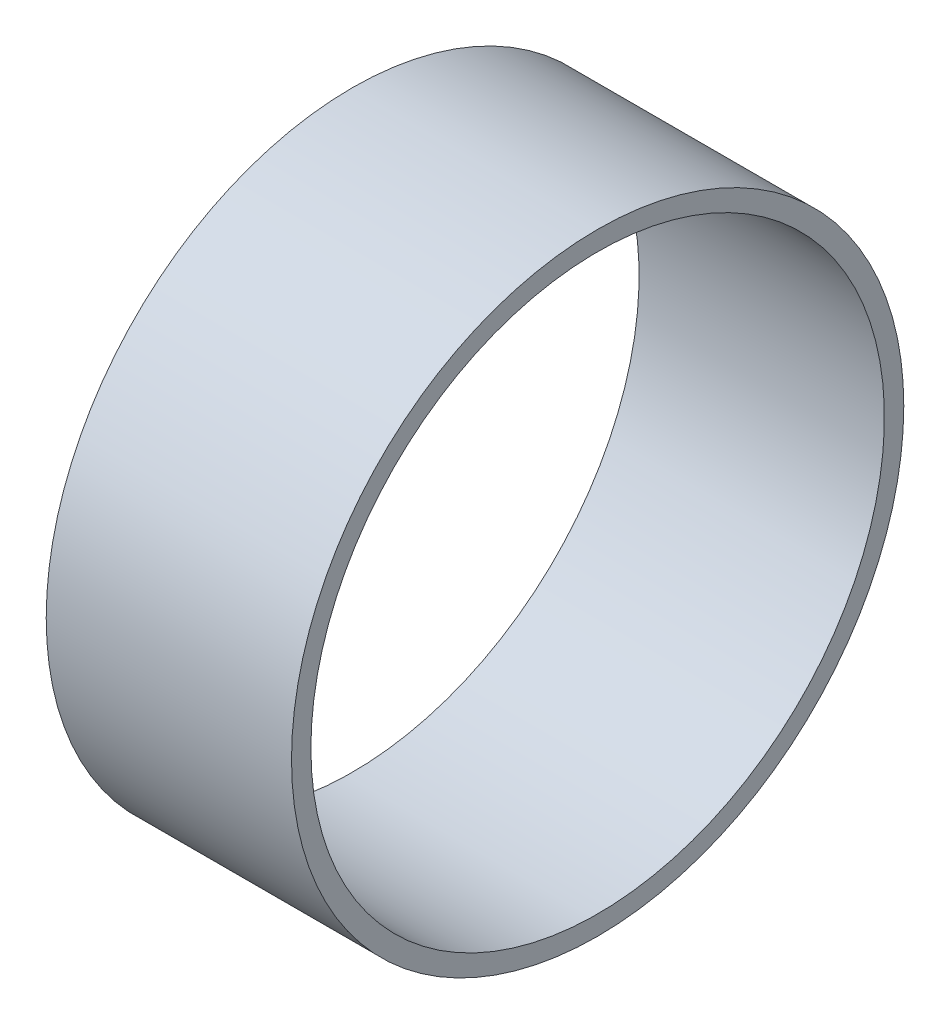
ISO-10303-21;
HEADER;
FILE_DESCRIPTION(('STEP AP214'),'2;1');
FILE_NAME('part.step','',(''),(''),'','','');
FILE_SCHEMA(('AUTOMOTIVE_DESIGN { 1 0 10303 214 1 1 1 1 }'));
ENDSEC;
DATA;
#1=APPLICATION_CONTEXT('core data for automotive mechanical design processes');
#2=APPLICATION_PROTOCOL_DEFINITION('international standard','automotive_design',2000,#1);
#3=PRODUCT_CONTEXT('',#1,'mechanical');
#4=PRODUCT('Part','Part','',(#3));
#5=PRODUCT_RELATED_PRODUCT_CATEGORY('part','',(#4));
#6=PRODUCT_DEFINITION_FORMATION('','',#4);
#7=PRODUCT_DEFINITION_CONTEXT('part definition',#1,'design');
#8=PRODUCT_DEFINITION('design','',#6,#7);
#9=PRODUCT_DEFINITION_SHAPE('','',#8);
#10=(LENGTH_UNIT() NAMED_UNIT(*) SI_UNIT(.MILLI.,.METRE.));
#11=(NAMED_UNIT(*) PLANE_ANGLE_UNIT() SI_UNIT($,.RADIAN.));
#12=(NAMED_UNIT(*) SI_UNIT($,.STERADIAN.) SOLID_ANGLE_UNIT());
#13=UNCERTAINTY_MEASURE_WITH_UNIT(LENGTH_MEASURE(1.E-05),#10,'distance_accuracy_value','');
#14=(GEOMETRIC_REPRESENTATION_CONTEXT(3) GLOBAL_UNCERTAINTY_ASSIGNED_CONTEXT((#13)) GLOBAL_UNIT_ASSIGNED_CONTEXT((#10,
#11,#12)) REPRESENTATION_CONTEXT('',''));
#15=CARTESIAN_POINT('',(0.,0.,0.));
#16=DIRECTION('',(0.,0.,1.));
#17=DIRECTION('',(1.,0.,0.));
#18=AXIS2_PLACEMENT_3D('',#15,#16,#17);
#19=CARTESIAN_POINT('',(50.815,0.,0.));
#20=DIRECTION('',(-1.,0.,0.));
#21=DIRECTION('',(0.,0.,1.));
#22=AXIS2_PLACEMENT_3D('',#19,#20,#21);
#23=CYLINDRICAL_SURFACE('',#22,7.4);
#24=CARTESIAN_POINT('',(47.65,0.,0.));
#25=DIRECTION('',(-1.,0.,0.));
#26=DIRECTION('',(0.,0.,1.));
#27=AXIS2_PLACEMENT_3D('',#24,#25,#26);
#28=CIRCLE('',#27,7.4);
#29=CARTESIAN_POINT('',(47.65,0.,7.4));
#30=VERTEX_POINT('',#29);
#31=EDGE_CURVE('E16',#30,#30,#28,.F.);
#32=ORIENTED_EDGE('',*,*,#31,.F.);
#33=EDGE_LOOP('',(#32));
#34=FACE_BOUND('',#33,.T.);
#35=CARTESIAN_POINT('',(53.98,0.,0.));
#36=DIRECTION('',(-1.,0.,0.));
#37=DIRECTION('',(0.,0.,1.));
#38=AXIS2_PLACEMENT_3D('',#35,#36,#37);
#39=CIRCLE('',#38,7.4);
#40=CARTESIAN_POINT('',(53.98,0.,7.4));
#41=VERTEX_POINT('',#40);
#42=EDGE_CURVE('E25',#41,#41,#39,.T.);
#43=ORIENTED_EDGE('',*,*,#42,.F.);
#44=EDGE_LOOP('',(#43));
#45=FACE_BOUND('',#44,.T.);
#46=ADVANCED_FACE('F13',(#34,#45),#23,.F.);
#47=CARTESIAN_POINT('',(47.65,0.,7.65));
#48=DIRECTION('',(-1.,0.,0.));
#49=DIRECTION('',(0.,0.,1.));
#50=AXIS2_PLACEMENT_3D('',#47,#48,#49);
#51=PLANE('',#50);
#52=ORIENTED_EDGE('',*,*,#31,.T.);
#53=EDGE_LOOP('',(#52));
#54=FACE_BOUND('',#53,.T.);
#55=CARTESIAN_POINT('',(47.65,0.,0.));
#56=DIRECTION('',(-1.,0.,0.));
#57=DIRECTION('',(0.,0.,1.));
#58=AXIS2_PLACEMENT_3D('',#55,#56,#57);
#59=CIRCLE('',#58,7.9);
#60=CARTESIAN_POINT('',(47.65,0.,7.9));
#61=VERTEX_POINT('',#60);
#62=EDGE_CURVE('E20',#61,#61,#59,.F.);
#63=ORIENTED_EDGE('',*,*,#62,.F.);
#64=EDGE_LOOP('',(#63));
#65=FACE_BOUND('',#64,.T.);
#66=ADVANCED_FACE('F33',(#54,#65),#51,.T.);
#67=CARTESIAN_POINT('',(53.98,0.,7.65));
#68=DIRECTION('',(1.,0.,0.));
#69=DIRECTION('',(0.,0.,-1.));
#70=AXIS2_PLACEMENT_3D('',#67,#68,#69);
#71=PLANE('',#70);
#72=CARTESIAN_POINT('',(53.98,0.,0.));
#73=DIRECTION('',(-1.,0.,0.));
#74=DIRECTION('',(0.,0.,1.));
#75=AXIS2_PLACEMENT_3D('',#72,#73,#74);
#76=CIRCLE('',#75,7.9);
#77=CARTESIAN_POINT('',(53.98,0.,7.9));
#78=VERTEX_POINT('',#77);
#79=EDGE_CURVE('E9',#78,#78,#76,.T.);
#80=ORIENTED_EDGE('',*,*,#79,.F.);
#81=EDGE_LOOP('',(#80));
#82=FACE_BOUND('',#81,.T.);
#83=ORIENTED_EDGE('',*,*,#42,.T.);
#84=EDGE_LOOP('',(#83));
#85=FACE_BOUND('',#84,.T.);
#86=ADVANCED_FACE('F44',(#82,#85),#71,.T.);
#87=CARTESIAN_POINT('',(50.815,0.,0.));
#88=DIRECTION('',(-1.,0.,0.));
#89=DIRECTION('',(0.,0.,1.));
#90=AXIS2_PLACEMENT_3D('',#87,#88,#89);
#91=CYLINDRICAL_SURFACE('',#90,7.9);
#92=ORIENTED_EDGE('',*,*,#62,.T.);
#93=EDGE_LOOP('',(#92));
#94=FACE_BOUND('',#93,.T.);
#95=ORIENTED_EDGE('',*,*,#79,.T.);
#96=EDGE_LOOP('',(#95));
#97=FACE_BOUND('',#96,.T.);
#98=ADVANCED_FACE('F45',(#94,#97),#91,.T.);
#99=CLOSED_SHELL('',(#46,#66,#86,#98));
#100=MANIFOLD_SOLID_BREP('B1',#99);
#101=ADVANCED_BREP_SHAPE_REPRESENTATION('',(#18,#100),#14);
#102=SHAPE_DEFINITION_REPRESENTATION(#9,#101);
ENDSEC;
END-ISO-10303-21;
